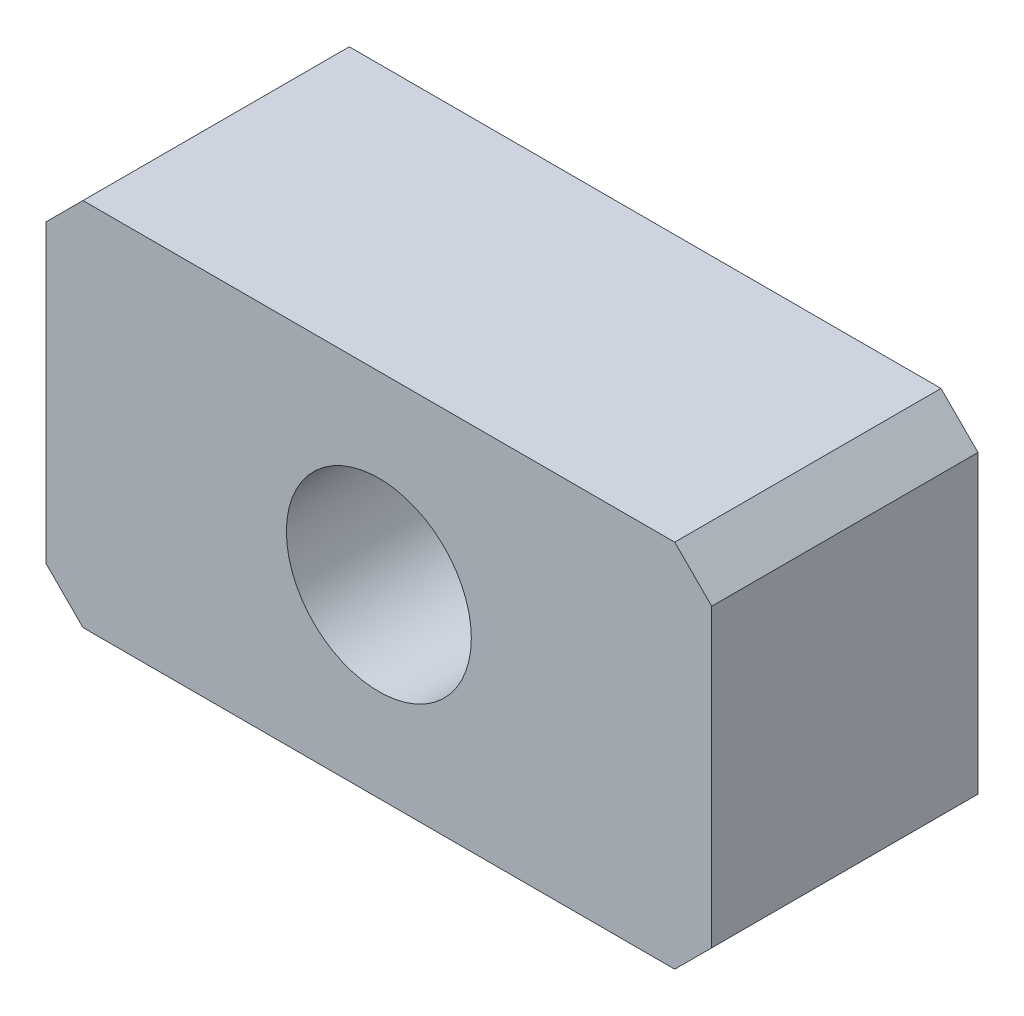
ISO-10303-21;
HEADER;
FILE_DESCRIPTION(('STEP AP214'),'2;1');
FILE_NAME('part.step','',(''),(''),'','','');
FILE_SCHEMA(('AUTOMOTIVE_DESIGN { 1 0 10303 214 1 1 1 1 }'));
ENDSEC;
DATA;
#1=APPLICATION_CONTEXT('core data for automotive mechanical design processes');
#2=APPLICATION_PROTOCOL_DEFINITION('international standard','automotive_design',2000,#1);
#3=PRODUCT_CONTEXT('',#1,'mechanical');
#4=PRODUCT('Part','Part','',(#3));
#5=PRODUCT_RELATED_PRODUCT_CATEGORY('part','',(#4));
#6=PRODUCT_DEFINITION_FORMATION('','',#4);
#7=PRODUCT_DEFINITION_CONTEXT('part definition',#1,'design');
#8=PRODUCT_DEFINITION('design','',#6,#7);
#9=PRODUCT_DEFINITION_SHAPE('','',#8);
#10=(LENGTH_UNIT() NAMED_UNIT(*) SI_UNIT(.MILLI.,.METRE.));
#11=(NAMED_UNIT(*) PLANE_ANGLE_UNIT() SI_UNIT($,.RADIAN.));
#12=(NAMED_UNIT(*) SI_UNIT($,.STERADIAN.) SOLID_ANGLE_UNIT());
#13=UNCERTAINTY_MEASURE_WITH_UNIT(LENGTH_MEASURE(1.E-05),#10,'distance_accuracy_value','');
#14=(GEOMETRIC_REPRESENTATION_CONTEXT(3) GLOBAL_UNCERTAINTY_ASSIGNED_CONTEXT((#13)) GLOBAL_UNIT_ASSIGNED_CONTEXT((#10,
#11,#12)) REPRESENTATION_CONTEXT('',''));
#15=CARTESIAN_POINT('',(0.,0.,0.));
#16=DIRECTION('',(0.,0.,1.));
#17=DIRECTION('',(1.,0.,0.));
#18=AXIS2_PLACEMENT_3D('',#15,#16,#17);
#19=CARTESIAN_POINT('',(0.,0.,7.2));
#20=DIRECTION('',(0.,0.,1.));
#21=DIRECTION('',(1.,0.,0.));
#22=AXIS2_PLACEMENT_3D('',#19,#20,#21);
#23=PLANE('',#22);
#24=DIRECTION('',(0.,-1.,0.));
#25=VECTOR('',#24,1.);
#26=CARTESIAN_POINT('',(-9.,-5.,7.2));
#27=LINE('',#26,#25);
#28=CARTESIAN_POINT('',(-9.,4.,7.2));
#29=VERTEX_POINT('',#28);
#30=CARTESIAN_POINT('',(-9.,-4.,7.2));
#31=VERTEX_POINT('',#30);
#32=EDGE_CURVE('E140',#29,#31,#27,.T.);
#33=ORIENTED_EDGE('',*,*,#32,.T.);
#34=DIRECTION('',(-0.707106781186548,0.707106781186548,0.));
#35=VECTOR('',#34,1.);
#36=CARTESIAN_POINT('',(-6.5,-6.5,7.2));
#37=LINE('',#36,#35);
#38=CARTESIAN_POINT('',(-7.99999999999999,-5.,7.2));
#39=VERTEX_POINT('',#38);
#40=EDGE_CURVE('E155',#31,#39,#37,.F.);
#41=ORIENTED_EDGE('',*,*,#40,.T.);
#42=DIRECTION('',(1.,0.,0.));
#43=VECTOR('',#42,1.);
#44=CARTESIAN_POINT('',(9.,-5.,7.2));
#45=LINE('',#44,#43);
#46=CARTESIAN_POINT('',(8.,-5.,7.2));
#47=VERTEX_POINT('',#46);
#48=EDGE_CURVE('E122',#39,#47,#45,.T.);
#49=ORIENTED_EDGE('',*,*,#48,.T.);
#50=DIRECTION('',(-0.707106781186548,-0.707106781186547,0.));
#51=VECTOR('',#50,1.);
#52=CARTESIAN_POINT('',(6.49999999999999,-6.5,7.2));
#53=LINE('',#52,#51);
#54=CARTESIAN_POINT('',(9.,-4.,7.2));
#55=VERTEX_POINT('',#54);
#56=EDGE_CURVE('E153',#47,#55,#53,.F.);
#57=ORIENTED_EDGE('',*,*,#56,.T.);
#58=DIRECTION('',(0.,1.,0.));
#59=VECTOR('',#58,1.);
#60=CARTESIAN_POINT('',(9.,-5.,7.2));
#61=LINE('',#60,#59);
#62=CARTESIAN_POINT('',(9.,4.,7.2));
#63=VERTEX_POINT('',#62);
#64=EDGE_CURVE('E166',#55,#63,#61,.T.);
#65=ORIENTED_EDGE('',*,*,#64,.T.);
#66=DIRECTION('',(0.707106781186547,-0.707106781186548,0.));
#67=VECTOR('',#66,1.);
#68=CARTESIAN_POINT('',(6.50000000000001,6.5,7.2));
#69=LINE('',#68,#67);
#70=CARTESIAN_POINT('',(8.,5.,7.2));
#71=VERTEX_POINT('',#70);
#72=EDGE_CURVE('E57',#63,#71,#69,.F.);
#73=ORIENTED_EDGE('',*,*,#72,.T.);
#74=DIRECTION('',(-1.,0.,0.));
#75=VECTOR('',#74,1.);
#76=CARTESIAN_POINT('',(9.,5.,7.2));
#77=LINE('',#76,#75);
#78=CARTESIAN_POINT('',(-7.99999999999999,5.,7.2));
#79=VERTEX_POINT('',#78);
#80=EDGE_CURVE('E141',#71,#79,#77,.T.);
#81=ORIENTED_EDGE('',*,*,#80,.T.);
#82=DIRECTION('',(0.707106781186548,0.707106781186547,0.));
#83=VECTOR('',#82,1.);
#84=CARTESIAN_POINT('',(-6.49999999999999,6.5,7.2));
#85=LINE('',#84,#83);
#86=EDGE_CURVE('E150',#79,#29,#85,.F.);
#87=ORIENTED_EDGE('',*,*,#86,.T.);
#88=EDGE_LOOP('',(#33,#41,#49,#57,#65,#73,#81,#87));
#89=FACE_BOUND('',#88,.T.);
#90=CARTESIAN_POINT('',(0.,0.,7.2));
#91=DIRECTION('',(0.,0.,1.));
#92=DIRECTION('',(1.,0.,0.));
#93=AXIS2_PLACEMENT_3D('',#90,#91,#92);
#94=CIRCLE('',#93,2.5);
#95=CARTESIAN_POINT('',(2.5,0.,7.2));
#96=VERTEX_POINT('',#95);
#97=EDGE_CURVE('E135',#96,#96,#94,.T.);
#98=ORIENTED_EDGE('',*,*,#97,.F.);
#99=EDGE_LOOP('',(#98));
#100=FACE_BOUND('',#99,.T.);
#101=ADVANCED_FACE('F35',(#89,#100),#23,.T.);
#102=CARTESIAN_POINT('',(0.,0.,0.));
#103=DIRECTION('',(0.,0.,1.));
#104=DIRECTION('',(1.,0.,0.));
#105=AXIS2_PLACEMENT_3D('',#102,#103,#104);
#106=PLANE('',#105);
#107=DIRECTION('',(1.,0.,0.));
#108=VECTOR('',#107,1.);
#109=CARTESIAN_POINT('',(9.,-5.,0.));
#110=LINE('',#109,#108);
#111=CARTESIAN_POINT('',(-7.99999999999999,-5.,0.));
#112=VERTEX_POINT('',#111);
#113=CARTESIAN_POINT('',(8.,-5.,0.));
#114=VERTEX_POINT('',#113);
#115=EDGE_CURVE('E119',#112,#114,#110,.T.);
#116=ORIENTED_EDGE('',*,*,#115,.F.);
#117=DIRECTION('',(0.707106781186548,-0.707106781186548,0.));
#118=VECTOR('',#117,1.);
#119=CARTESIAN_POINT('',(-7.99999999999999,-5.,0.));
#120=LINE('',#119,#118);
#121=CARTESIAN_POINT('',(-9.,-4.,0.));
#122=VERTEX_POINT('',#121);
#123=EDGE_CURVE('E102',#112,#122,#120,.F.);
#124=ORIENTED_EDGE('',*,*,#123,.T.);
#125=DIRECTION('',(0.,-1.,0.));
#126=VECTOR('',#125,1.);
#127=CARTESIAN_POINT('',(-9.,-5.,0.));
#128=LINE('',#127,#126);
#129=CARTESIAN_POINT('',(-9.,4.,0.));
#130=VERTEX_POINT('',#129);
#131=EDGE_CURVE('E130',#130,#122,#128,.T.);
#132=ORIENTED_EDGE('',*,*,#131,.F.);
#133=DIRECTION('',(-0.707106781186548,-0.707106781186547,0.));
#134=VECTOR('',#133,1.);
#135=CARTESIAN_POINT('',(-9.,4.,0.));
#136=LINE('',#135,#134);
#137=CARTESIAN_POINT('',(-7.99999999999999,5.,0.));
#138=VERTEX_POINT('',#137);
#139=EDGE_CURVE('E123',#130,#138,#136,.F.);
#140=ORIENTED_EDGE('',*,*,#139,.T.);
#141=DIRECTION('',(-1.,0.,0.));
#142=VECTOR('',#141,1.);
#143=CARTESIAN_POINT('',(9.,5.,0.));
#144=LINE('',#143,#142);
#145=CARTESIAN_POINT('',(8.,5.,0.));
#146=VERTEX_POINT('',#145);
#147=EDGE_CURVE('E133',#146,#138,#144,.T.);
#148=ORIENTED_EDGE('',*,*,#147,.F.);
#149=DIRECTION('',(-0.707106781186547,0.707106781186548,0.));
#150=VECTOR('',#149,1.);
#151=CARTESIAN_POINT('',(8.,5.,0.));
#152=LINE('',#151,#150);
#153=CARTESIAN_POINT('',(9.,4.,0.));
#154=VERTEX_POINT('',#153);
#155=EDGE_CURVE('E144',#146,#154,#152,.F.);
#156=ORIENTED_EDGE('',*,*,#155,.T.);
#157=DIRECTION('',(0.,1.,0.));
#158=VECTOR('',#157,1.);
#159=CARTESIAN_POINT('',(9.,-5.,0.));
#160=LINE('',#159,#158);
#161=CARTESIAN_POINT('',(9.,-4.,0.));
#162=VERTEX_POINT('',#161);
#163=EDGE_CURVE('E129',#162,#154,#160,.T.);
#164=ORIENTED_EDGE('',*,*,#163,.F.);
#165=DIRECTION('',(0.707106781186548,0.707106781186547,0.));
#166=VECTOR('',#165,1.);
#167=CARTESIAN_POINT('',(9.,-4.,0.));
#168=LINE('',#167,#166);
#169=EDGE_CURVE('E113',#162,#114,#168,.F.);
#170=ORIENTED_EDGE('',*,*,#169,.T.);
#171=EDGE_LOOP('',(#116,#124,#132,#140,#148,#156,#164,#170));
#172=FACE_BOUND('',#171,.T.);
#173=CARTESIAN_POINT('',(0.,0.,0.));
#174=DIRECTION('',(0.,0.,1.));
#175=DIRECTION('',(1.,0.,0.));
#176=AXIS2_PLACEMENT_3D('',#173,#174,#175);
#177=CIRCLE('',#176,2.5);
#178=CARTESIAN_POINT('',(2.5,0.,0.));
#179=VERTEX_POINT('',#178);
#180=EDGE_CURVE('E180',#179,#179,#177,.T.);
#181=ORIENTED_EDGE('',*,*,#180,.T.);
#182=EDGE_LOOP('',(#181));
#183=FACE_BOUND('',#182,.T.);
#184=ADVANCED_FACE('F126',(#172,#183),#106,.F.);
#185=CARTESIAN_POINT('',(-9.,-5.,7.2));
#186=DIRECTION('',(1.,0.,0.));
#187=DIRECTION('',(0.,0.,-1.));
#188=AXIS2_PLACEMENT_3D('',#185,#186,#187);
#189=PLANE('',#188);
#190=ORIENTED_EDGE('',*,*,#131,.T.);
#191=DIRECTION('',(0.,0.,1.));
#192=VECTOR('',#191,1.);
#193=CARTESIAN_POINT('',(-9.,-4.,7.2));
#194=LINE('',#193,#192);
#195=EDGE_CURVE('E107',#122,#31,#194,.T.);
#196=ORIENTED_EDGE('',*,*,#195,.T.);
#197=ORIENTED_EDGE('',*,*,#32,.F.);
#198=DIRECTION('',(0.,0.,-1.));
#199=VECTOR('',#198,1.);
#200=CARTESIAN_POINT('',(-9.,4.,7.2));
#201=LINE('',#200,#199);
#202=EDGE_CURVE('E112',#29,#130,#201,.T.);
#203=ORIENTED_EDGE('',*,*,#202,.T.);
#204=EDGE_LOOP('',(#190,#196,#197,#203));
#205=FACE_BOUND('',#204,.T.);
#206=ADVANCED_FACE('F194',(#205),#189,.F.);
#207=CARTESIAN_POINT('',(9.,-5.,7.2));
#208=DIRECTION('',(0.,1.,0.));
#209=DIRECTION('',(-1.,0.,0.));
#210=AXIS2_PLACEMENT_3D('',#207,#208,#209);
#211=PLANE('',#210);
#212=ORIENTED_EDGE('',*,*,#48,.F.);
#213=DIRECTION('',(0.,0.,-1.));
#214=VECTOR('',#213,1.);
#215=CARTESIAN_POINT('',(-7.99999999999999,-5.,7.2));
#216=LINE('',#215,#214);
#217=EDGE_CURVE('E106',#39,#112,#216,.T.);
#218=ORIENTED_EDGE('',*,*,#217,.T.);
#219=ORIENTED_EDGE('',*,*,#115,.T.);
#220=DIRECTION('',(0.,0.,1.));
#221=VECTOR('',#220,1.);
#222=CARTESIAN_POINT('',(8.,-5.,7.2));
#223=LINE('',#222,#221);
#224=EDGE_CURVE('E124',#114,#47,#223,.T.);
#225=ORIENTED_EDGE('',*,*,#224,.T.);
#226=EDGE_LOOP('',(#212,#218,#219,#225));
#227=FACE_BOUND('',#226,.T.);
#228=ADVANCED_FACE('F118',(#227),#211,.F.);
#229=CARTESIAN_POINT('',(9.,-5.,7.2));
#230=DIRECTION('',(-1.,0.,0.));
#231=DIRECTION('',(0.,0.,1.));
#232=AXIS2_PLACEMENT_3D('',#229,#230,#231);
#233=PLANE('',#232);
#234=ORIENTED_EDGE('',*,*,#64,.F.);
#235=DIRECTION('',(0.,0.,-1.));
#236=VECTOR('',#235,1.);
#237=CARTESIAN_POINT('',(9.,-4.,7.2));
#238=LINE('',#237,#236);
#239=EDGE_CURVE('E159',#55,#162,#238,.T.);
#240=ORIENTED_EDGE('',*,*,#239,.T.);
#241=ORIENTED_EDGE('',*,*,#163,.T.);
#242=DIRECTION('',(0.,0.,1.));
#243=VECTOR('',#242,1.);
#244=CARTESIAN_POINT('',(9.,4.,7.2));
#245=LINE('',#244,#243);
#246=EDGE_CURVE('E157',#154,#63,#245,.T.);
#247=ORIENTED_EDGE('',*,*,#246,.T.);
#248=EDGE_LOOP('',(#234,#240,#241,#247));
#249=FACE_BOUND('',#248,.T.);
#250=ADVANCED_FACE('F164',(#249),#233,.F.);
#251=CARTESIAN_POINT('',(9.,5.,7.2));
#252=DIRECTION('',(0.,-1.,0.));
#253=DIRECTION('',(1.,0.,0.));
#254=AXIS2_PLACEMENT_3D('',#251,#252,#253);
#255=PLANE('',#254);
#256=ORIENTED_EDGE('',*,*,#80,.F.);
#257=DIRECTION('',(0.,0.,-1.));
#258=VECTOR('',#257,1.);
#259=CARTESIAN_POINT('',(8.,5.,7.2));
#260=LINE('',#259,#258);
#261=EDGE_CURVE('E11',#71,#146,#260,.T.);
#262=ORIENTED_EDGE('',*,*,#261,.T.);
#263=ORIENTED_EDGE('',*,*,#147,.T.);
#264=DIRECTION('',(0.,0.,1.));
#265=VECTOR('',#264,1.);
#266=CARTESIAN_POINT('',(-7.99999999999999,5.,7.2));
#267=LINE('',#266,#265);
#268=EDGE_CURVE('E44',#138,#79,#267,.T.);
#269=ORIENTED_EDGE('',*,*,#268,.T.);
#270=EDGE_LOOP('',(#256,#262,#263,#269));
#271=FACE_BOUND('',#270,.T.);
#272=ADVANCED_FACE('F173',(#271),#255,.F.);
#273=CARTESIAN_POINT('',(0.,0.,7.2));
#274=DIRECTION('',(0.,0.,-1.));
#275=DIRECTION('',(-1.,0.,0.));
#276=AXIS2_PLACEMENT_3D('',#273,#274,#275);
#277=CYLINDRICAL_SURFACE('',#276,2.5);
#278=ORIENTED_EDGE('',*,*,#97,.T.);
#279=EDGE_LOOP('',(#278));
#280=FACE_BOUND('',#279,.T.);
#281=ORIENTED_EDGE('',*,*,#180,.F.);
#282=EDGE_LOOP('',(#281));
#283=FACE_BOUND('',#282,.T.);
#284=ADVANCED_FACE('F186',(#280,#283),#277,.F.);
#285=CARTESIAN_POINT('',(-7.99999999999999,-5.,7.2));
#286=DIRECTION('',(0.707106781186548,0.707106781186548,0.));
#287=DIRECTION('',(0.,0.,-1.));
#288=AXIS2_PLACEMENT_3D('',#285,#286,#287);
#289=PLANE('',#288);
#290=ORIENTED_EDGE('',*,*,#40,.F.);
#291=ORIENTED_EDGE('',*,*,#195,.F.);
#292=ORIENTED_EDGE('',*,*,#123,.F.);
#293=ORIENTED_EDGE('',*,*,#217,.F.);
#294=EDGE_LOOP('',(#290,#291,#292,#293));
#295=FACE_BOUND('',#294,.T.);
#296=ADVANCED_FACE('F105',(#295),#289,.F.);
#297=CARTESIAN_POINT('',(9.,-4.,7.2));
#298=DIRECTION('',(-0.707106781186547,0.707106781186548,0.));
#299=DIRECTION('',(0.,0.,-1.));
#300=AXIS2_PLACEMENT_3D('',#297,#298,#299);
#301=PLANE('',#300);
#302=ORIENTED_EDGE('',*,*,#56,.F.);
#303=ORIENTED_EDGE('',*,*,#224,.F.);
#304=ORIENTED_EDGE('',*,*,#169,.F.);
#305=ORIENTED_EDGE('',*,*,#239,.F.);
#306=EDGE_LOOP('',(#302,#303,#304,#305));
#307=FACE_BOUND('',#306,.T.);
#308=ADVANCED_FACE('F213',(#307),#301,.F.);
#309=CARTESIAN_POINT('',(8.,5.,7.2));
#310=DIRECTION('',(-0.707106781186548,-0.707106781186547,0.));
#311=DIRECTION('',(0.,0.,-1.));
#312=AXIS2_PLACEMENT_3D('',#309,#310,#311);
#313=PLANE('',#312);
#314=ORIENTED_EDGE('',*,*,#72,.F.);
#315=ORIENTED_EDGE('',*,*,#246,.F.);
#316=ORIENTED_EDGE('',*,*,#155,.F.);
#317=ORIENTED_EDGE('',*,*,#261,.F.);
#318=EDGE_LOOP('',(#314,#315,#316,#317));
#319=FACE_BOUND('',#318,.T.);
#320=ADVANCED_FACE('F172',(#319),#313,.F.);
#321=CARTESIAN_POINT('',(-9.,4.,7.2));
#322=DIRECTION('',(0.707106781186547,-0.707106781186548,0.));
#323=DIRECTION('',(0.,0.,-1.));
#324=AXIS2_PLACEMENT_3D('',#321,#322,#323);
#325=PLANE('',#324);
#326=ORIENTED_EDGE('',*,*,#86,.F.);
#327=ORIENTED_EDGE('',*,*,#268,.F.);
#328=ORIENTED_EDGE('',*,*,#139,.F.);
#329=ORIENTED_EDGE('',*,*,#202,.F.);
#330=EDGE_LOOP('',(#326,#327,#328,#329));
#331=FACE_BOUND('',#330,.T.);
#332=ADVANCED_FACE('F38',(#331),#325,.F.);
#333=CLOSED_SHELL('',(#101,#184,#206,#228,#250,#272,#284,#296,#308,#320,#332));
#334=MANIFOLD_SOLID_BREP('B2',#333);
#335=ADVANCED_BREP_SHAPE_REPRESENTATION('',(#18,#334),#14);
#336=SHAPE_DEFINITION_REPRESENTATION(#9,#335);
ENDSEC;
END-ISO-10303-21;
